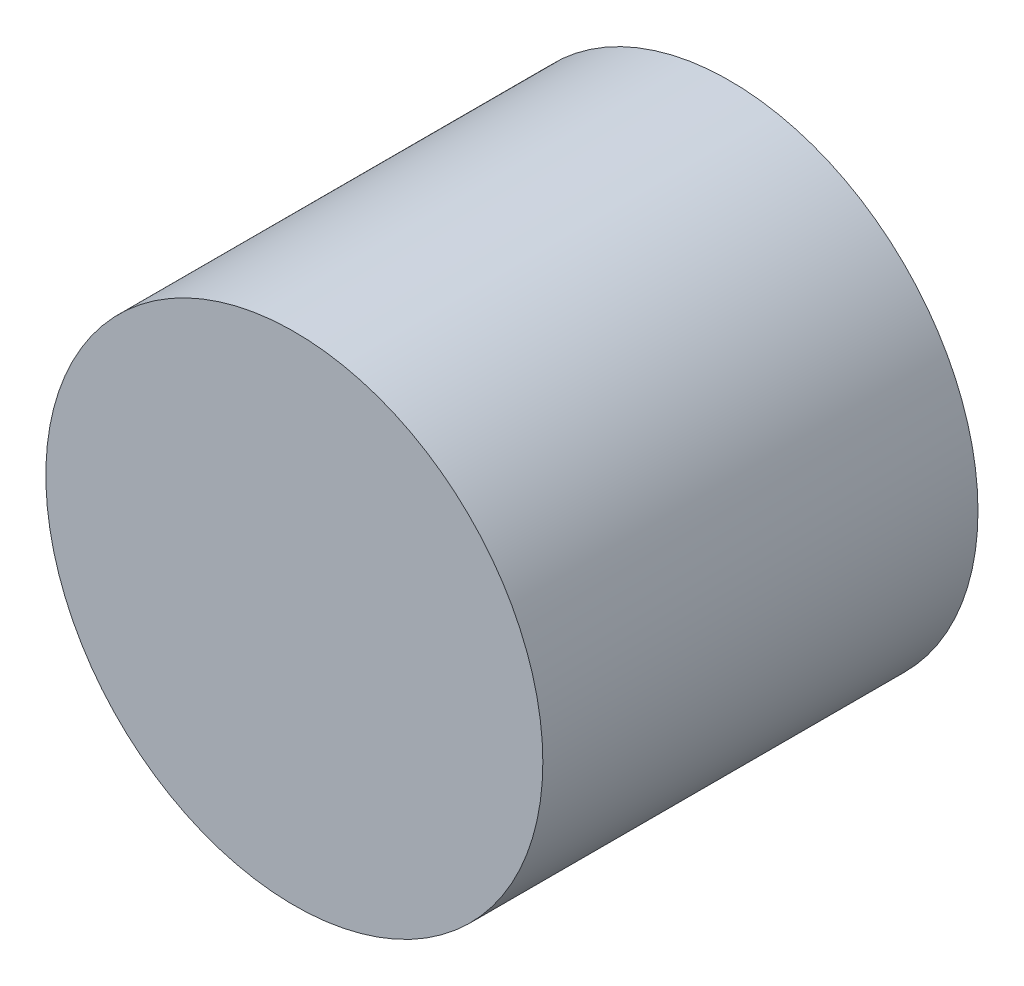
ISO-10303-21;
HEADER;
FILE_DESCRIPTION(('STEP AP214'),'2;1');
FILE_NAME('part.step','',(''),(''),'','','');
FILE_SCHEMA(('AUTOMOTIVE_DESIGN { 1 0 10303 214 1 1 1 1 }'));
ENDSEC;
DATA;
#1=APPLICATION_CONTEXT('core data for automotive mechanical design processes');
#2=APPLICATION_PROTOCOL_DEFINITION('international standard','automotive_design',2000,#1);
#3=PRODUCT_CONTEXT('',#1,'mechanical');
#4=PRODUCT('Part','Part','',(#3));
#5=PRODUCT_RELATED_PRODUCT_CATEGORY('part','',(#4));
#6=PRODUCT_DEFINITION_FORMATION('','',#4);
#7=PRODUCT_DEFINITION_CONTEXT('part definition',#1,'design');
#8=PRODUCT_DEFINITION('design','',#6,#7);
#9=PRODUCT_DEFINITION_SHAPE('','',#8);
#10=(LENGTH_UNIT() NAMED_UNIT(*) SI_UNIT(.MILLI.,.METRE.));
#11=(NAMED_UNIT(*) PLANE_ANGLE_UNIT() SI_UNIT($,.RADIAN.));
#12=(NAMED_UNIT(*) SI_UNIT($,.STERADIAN.) SOLID_ANGLE_UNIT());
#13=UNCERTAINTY_MEASURE_WITH_UNIT(LENGTH_MEASURE(1.E-05),#10,'distance_accuracy_value','');
#14=(GEOMETRIC_REPRESENTATION_CONTEXT(3) GLOBAL_UNCERTAINTY_ASSIGNED_CONTEXT((#13)) GLOBAL_UNIT_ASSIGNED_CONTEXT((#10,
#11,#12)) REPRESENTATION_CONTEXT('',''));
#15=CARTESIAN_POINT('',(0.,0.,0.));
#16=DIRECTION('',(0.,0.,1.));
#17=DIRECTION('',(1.,0.,0.));
#18=AXIS2_PLACEMENT_3D('',#15,#16,#17);
#19=CARTESIAN_POINT('',(0.,0.,14.));
#20=DIRECTION('',(0.,0.,-1.));
#21=DIRECTION('',(-1.00000000000002,0.,0.));
#22=AXIS2_PLACEMENT_3D('',#19,#20,#21);
#23=CYLINDRICAL_SURFACE('',#22,7.995);
#24=CARTESIAN_POINT('',(0.,0.,14.));
#25=DIRECTION('',(0.,0.,1.));
#26=DIRECTION('',(1.00000000000002,0.,0.));
#27=AXIS2_PLACEMENT_3D('',#24,#25,#26);
#28=CIRCLE('',#27,7.995);
#29=CARTESIAN_POINT('',(7.99500000000014,0.,14.));
#30=VERTEX_POINT('',#29);
#31=EDGE_CURVE('E10',#30,#30,#28,.T.);
#32=ORIENTED_EDGE('',*,*,#31,.F.);
#33=EDGE_LOOP('',(#32));
#34=FACE_BOUND('',#33,.T.);
#35=CARTESIAN_POINT('',(0.,0.,0.));
#36=DIRECTION('',(0.,0.,1.));
#37=DIRECTION('',(1.00000000000002,0.,0.));
#38=AXIS2_PLACEMENT_3D('',#35,#36,#37);
#39=CIRCLE('',#38,7.995);
#40=CARTESIAN_POINT('',(7.99500000000014,0.,0.));
#41=VERTEX_POINT('',#40);
#42=EDGE_CURVE('E35',#41,#41,#39,.T.);
#43=ORIENTED_EDGE('',*,*,#42,.T.);
#44=EDGE_LOOP('',(#43));
#45=FACE_BOUND('',#44,.T.);
#46=ADVANCED_FACE('F32',(#34,#45),#23,.T.);
#47=CARTESIAN_POINT('',(0.,0.,14.));
#48=DIRECTION('',(0.,0.,1.));
#49=DIRECTION('',(1.00000000000002,0.,0.));
#50=AXIS2_PLACEMENT_3D('',#47,#48,#49);
#51=PLANE('',#50);
#52=ORIENTED_EDGE('',*,*,#31,.T.);
#53=EDGE_LOOP('',(#52));
#54=FACE_BOUND('',#53,.T.);
#55=ADVANCED_FACE('F47',(#54),#51,.T.);
#56=CARTESIAN_POINT('',(0.,0.,0.));
#57=DIRECTION('',(0.,0.,1.));
#58=DIRECTION('',(1.00000000000002,0.,0.));
#59=AXIS2_PLACEMENT_3D('',#56,#57,#58);
#60=PLANE('',#59);
#61=ORIENTED_EDGE('',*,*,#42,.F.);
#62=EDGE_LOOP('',(#61));
#63=FACE_BOUND('',#62,.T.);
#64=ADVANCED_FACE('F45',(#63),#60,.F.);
#65=CLOSED_SHELL('',(#46,#55,#64));
#66=MANIFOLD_SOLID_BREP('B2',#65);
#67=ADVANCED_BREP_SHAPE_REPRESENTATION('',(#18,#66),#14);
#68=SHAPE_DEFINITION_REPRESENTATION(#9,#67);
ENDSEC;
END-ISO-10303-21;
